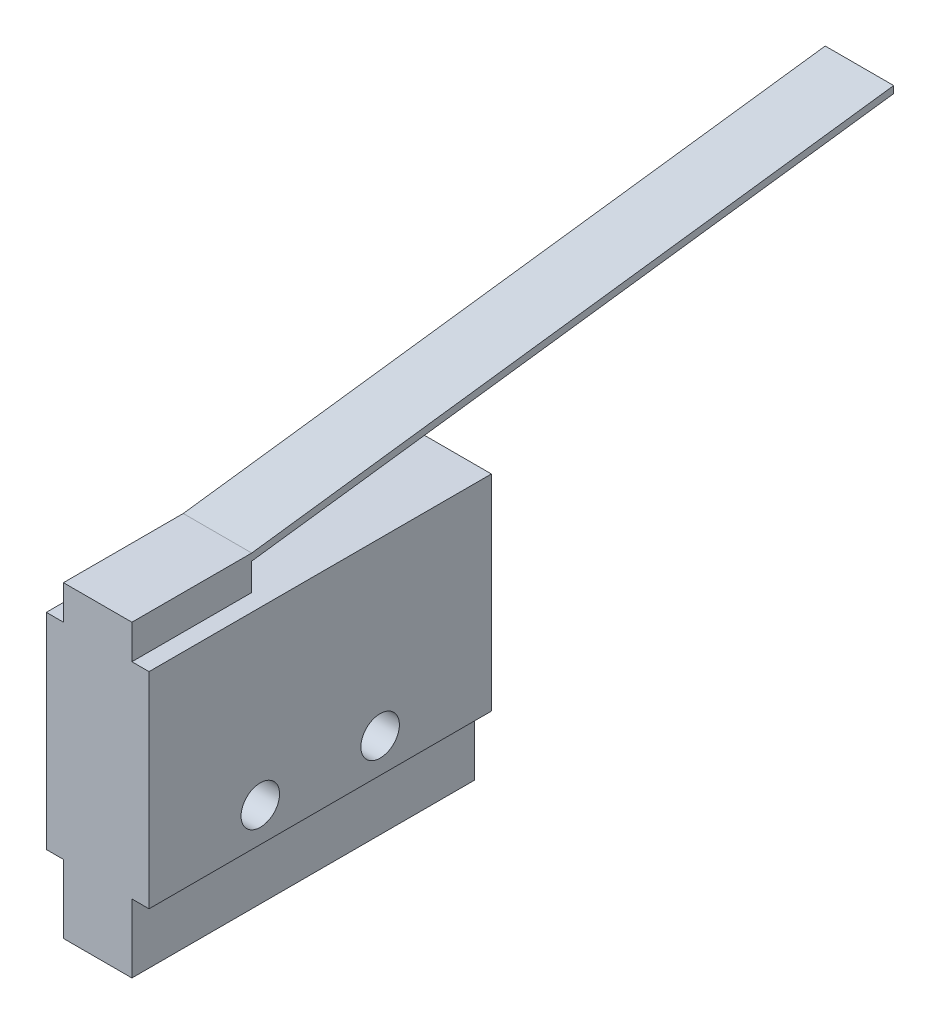
ISO-10303-21;
HEADER;
FILE_DESCRIPTION(('STEP AP214'),'2;1');
FILE_NAME('part.step','',(''),(''),'','','');
FILE_SCHEMA(('AUTOMOTIVE_DESIGN { 1 0 10303 214 1 1 1 1 }'));
ENDSEC;
DATA;
#1=APPLICATION_CONTEXT('core data for automotive mechanical design processes');
#2=APPLICATION_PROTOCOL_DEFINITION('international standard','automotive_design',2000,#1);
#3=PRODUCT_CONTEXT('',#1,'mechanical');
#4=PRODUCT('Part','Part','',(#3));
#5=PRODUCT_RELATED_PRODUCT_CATEGORY('part','',(#4));
#6=PRODUCT_DEFINITION_FORMATION('','',#4);
#7=PRODUCT_DEFINITION_CONTEXT('part definition',#1,'design');
#8=PRODUCT_DEFINITION('design','',#6,#7);
#9=PRODUCT_DEFINITION_SHAPE('','',#8);
#10=(LENGTH_UNIT() NAMED_UNIT(*) SI_UNIT(.MILLI.,.METRE.));
#11=(NAMED_UNIT(*) PLANE_ANGLE_UNIT() SI_UNIT($,.RADIAN.));
#12=(NAMED_UNIT(*) SI_UNIT($,.STERADIAN.) SOLID_ANGLE_UNIT());
#13=UNCERTAINTY_MEASURE_WITH_UNIT(LENGTH_MEASURE(1.E-05),#10,'distance_accuracy_value','');
#14=(GEOMETRIC_REPRESENTATION_CONTEXT(3) GLOBAL_UNCERTAINTY_ASSIGNED_CONTEXT((#13)) GLOBAL_UNIT_ASSIGNED_CONTEXT((#10,
#11,#12)) REPRESENTATION_CONTEXT('',''));
#15=CARTESIAN_POINT('',(0.,0.,0.));
#16=DIRECTION('',(0.,0.,1.));
#17=DIRECTION('',(1.,0.,0.));
#18=AXIS2_PLACEMENT_3D('',#15,#16,#17);
#19=CARTESIAN_POINT('',(0.,10.,0.));
#20=DIRECTION('',(0.,-1.,0.));
#21=DIRECTION('',(0.,0.,-1.));
#22=AXIS2_PLACEMENT_3D('',#19,#20,#21);
#23=PLANE('',#22);
#24=DIRECTION('',(0.,0.,1.));
#25=VECTOR('',#24,1.);
#26=CARTESIAN_POINT('',(1.,10.,0.));
#27=LINE('',#26,#25);
#28=CARTESIAN_POINT('',(1.,10.,-7.));
#29=VERTEX_POINT('',#28);
#30=CARTESIAN_POINT('',(1.,10.,0.));
#31=VERTEX_POINT('',#30);
#32=EDGE_CURVE('E340',#29,#31,#27,.T.);
#33=ORIENTED_EDGE('',*,*,#32,.F.);
#34=DIRECTION('',(-1.,0.,0.));
#35=VECTOR('',#34,1.);
#36=CARTESIAN_POINT('',(1.,10.,-7.));
#37=LINE('',#36,#35);
#38=CARTESIAN_POINT('',(5.,10.,-7.));
#39=VERTEX_POINT('',#38);
#40=EDGE_CURVE('E196',#39,#29,#37,.T.);
#41=ORIENTED_EDGE('',*,*,#40,.F.);
#42=DIRECTION('',(0.,0.,-1.));
#43=VECTOR('',#42,1.);
#44=CARTESIAN_POINT('',(5.,10.,0.));
#45=LINE('',#44,#43);
#46=CARTESIAN_POINT('',(5.,10.,0.));
#47=VERTEX_POINT('',#46);
#48=EDGE_CURVE('E68',#47,#39,#45,.T.);
#49=ORIENTED_EDGE('',*,*,#48,.F.);
#50=DIRECTION('',(1.,0.,0.));
#51=VECTOR('',#50,1.);
#52=CARTESIAN_POINT('',(0.,10.,0.));
#53=LINE('',#52,#51);
#54=CARTESIAN_POINT('',(6.,10.,0.));
#55=VERTEX_POINT('',#54);
#56=EDGE_CURVE('E289',#47,#55,#53,.T.);
#57=ORIENTED_EDGE('',*,*,#56,.T.);
#58=DIRECTION('',(0.,0.,-1.));
#59=VECTOR('',#58,1.);
#60=CARTESIAN_POINT('',(6.,10.,0.));
#61=LINE('',#60,#59);
#62=CARTESIAN_POINT('',(6.,10.,-20.));
#63=VERTEX_POINT('',#62);
#64=EDGE_CURVE('E293',#55,#63,#61,.T.);
#65=ORIENTED_EDGE('',*,*,#64,.T.);
#66=DIRECTION('',(-1.,0.,0.));
#67=VECTOR('',#66,1.);
#68=CARTESIAN_POINT('',(0.,10.,-20.));
#69=LINE('',#68,#67);
#70=CARTESIAN_POINT('',(0.,10.,-20.));
#71=VERTEX_POINT('',#70);
#72=EDGE_CURVE('E296',#63,#71,#69,.T.);
#73=ORIENTED_EDGE('',*,*,#72,.T.);
#74=DIRECTION('',(0.,0.,1.));
#75=VECTOR('',#74,1.);
#76=CARTESIAN_POINT('',(0.,10.,0.));
#77=LINE('',#76,#75);
#78=CARTESIAN_POINT('',(0.,10.,0.));
#79=VERTEX_POINT('',#78);
#80=EDGE_CURVE('E285',#71,#79,#77,.T.);
#81=ORIENTED_EDGE('',*,*,#80,.T.);
#82=EDGE_CURVE('E290',#79,#31,#53,.T.);
#83=ORIENTED_EDGE('',*,*,#82,.T.);
#84=EDGE_LOOP('',(#33,#41,#49,#57,#65,#73,#81,#83));
#85=FACE_BOUND('',#84,.T.);
#86=ADVANCED_FACE('F38',(#85),#23,.F.);
#87=CARTESIAN_POINT('',(0.,-2.,0.));
#88=DIRECTION('',(0.,-1.,0.));
#89=DIRECTION('',(0.,0.,-1.));
#90=AXIS2_PLACEMENT_3D('',#87,#88,#89);
#91=PLANE('',#90);
#92=DIRECTION('',(0.,0.,1.));
#93=VECTOR('',#92,1.);
#94=CARTESIAN_POINT('',(5.,-2.,-20.));
#95=LINE('',#94,#93);
#96=CARTESIAN_POINT('',(5.,-2.,-20.));
#97=VERTEX_POINT('',#96);
#98=CARTESIAN_POINT('',(5.,-2.,0.));
#99=VERTEX_POINT('',#98);
#100=EDGE_CURVE('E219',#97,#99,#95,.T.);
#101=ORIENTED_EDGE('',*,*,#100,.F.);
#102=DIRECTION('',(1.,0.,0.));
#103=VECTOR('',#102,1.);
#104=CARTESIAN_POINT('',(0.,-2.,-20.));
#105=LINE('',#104,#103);
#106=CARTESIAN_POINT('',(6.,-2.,-20.));
#107=VERTEX_POINT('',#106);
#108=EDGE_CURVE('E274',#97,#107,#105,.T.);
#109=ORIENTED_EDGE('',*,*,#108,.T.);
#110=DIRECTION('',(0.,0.,1.));
#111=VECTOR('',#110,1.);
#112=CARTESIAN_POINT('',(6.,-2.,0.));
#113=LINE('',#112,#111);
#114=CARTESIAN_POINT('',(6.,-2.,0.));
#115=VERTEX_POINT('',#114);
#116=EDGE_CURVE('E278',#107,#115,#113,.T.);
#117=ORIENTED_EDGE('',*,*,#116,.T.);
#118=DIRECTION('',(-1.,0.,0.));
#119=VECTOR('',#118,1.);
#120=CARTESIAN_POINT('',(0.,-2.,0.));
#121=LINE('',#120,#119);
#122=EDGE_CURVE('E283',#115,#99,#121,.T.);
#123=ORIENTED_EDGE('',*,*,#122,.T.);
#124=EDGE_LOOP('',(#101,#109,#117,#123));
#125=FACE_BOUND('',#124,.T.);
#126=ADVANCED_FACE('F316',(#125),#91,.T.);
#127=CARTESIAN_POINT('',(0.,10.,0.));
#128=DIRECTION('',(1.,0.,0.));
#129=DIRECTION('',(0.,0.,-1.));
#130=AXIS2_PLACEMENT_3D('',#127,#128,#129);
#131=PLANE('',#130);
#132=CARTESIAN_POINT('',(0.,0.,-6.5));
#133=DIRECTION('',(1.,0.,0.));
#134=DIRECTION('',(0.,0.,-1.));
#135=AXIS2_PLACEMENT_3D('',#132,#133,#134);
#136=CIRCLE('',#135,1.125);
#137=CARTESIAN_POINT('',(0.,0.,-7.625));
#138=VERTEX_POINT('',#137);
#139=EDGE_CURVE('E266',#138,#138,#136,.T.);
#140=ORIENTED_EDGE('',*,*,#139,.T.);
#141=EDGE_LOOP('',(#140));
#142=FACE_BOUND('',#141,.T.);
#143=CARTESIAN_POINT('',(0.,0.,-13.5));
#144=DIRECTION('',(1.,0.,0.));
#145=DIRECTION('',(0.,0.,-1.));
#146=AXIS2_PLACEMENT_3D('',#143,#144,#145);
#147=CIRCLE('',#146,1.125);
#148=CARTESIAN_POINT('',(0.,0.,-14.625));
#149=VERTEX_POINT('',#148);
#150=EDGE_CURVE('E259',#149,#149,#147,.T.);
#151=ORIENTED_EDGE('',*,*,#150,.T.);
#152=EDGE_LOOP('',(#151));
#153=FACE_BOUND('',#152,.T.);
#154=DIRECTION('',(0.,-1.,0.));
#155=VECTOR('',#154,1.);
#156=CARTESIAN_POINT('',(0.,10.,-20.));
#157=LINE('',#156,#155);
#158=CARTESIAN_POINT('',(0.,-2.,-20.));
#159=VERTEX_POINT('',#158);
#160=EDGE_CURVE('E299',#71,#159,#157,.T.);
#161=ORIENTED_EDGE('',*,*,#160,.T.);
#162=DIRECTION('',(0.,0.,-1.));
#163=VECTOR('',#162,1.);
#164=CARTESIAN_POINT('',(0.,-2.,0.));
#165=LINE('',#164,#163);
#166=CARTESIAN_POINT('',(0.,-2.,0.));
#167=VERTEX_POINT('',#166);
#168=EDGE_CURVE('E270',#167,#159,#165,.T.);
#169=ORIENTED_EDGE('',*,*,#168,.F.);
#170=DIRECTION('',(0.,-1.,0.));
#171=VECTOR('',#170,1.);
#172=CARTESIAN_POINT('',(0.,10.,0.));
#173=LINE('',#172,#171);
#174=EDGE_CURVE('E11',#79,#167,#173,.T.);
#175=ORIENTED_EDGE('',*,*,#174,.F.);
#176=ORIENTED_EDGE('',*,*,#80,.F.);
#177=EDGE_LOOP('',(#161,#169,#175,#176));
#178=FACE_BOUND('',#177,.T.);
#179=ADVANCED_FACE('F40',(#142,#153,#178),#131,.F.);
#180=CARTESIAN_POINT('',(0.,10.,0.));
#181=DIRECTION('',(0.,0.,-1.));
#182=DIRECTION('',(-1.,0.,0.));
#183=AXIS2_PLACEMENT_3D('',#180,#181,#182);
#184=PLANE('',#183);
#185=ORIENTED_EDGE('',*,*,#56,.F.);
#186=DIRECTION('',(0.,-1.,0.));
#187=VECTOR('',#186,1.);
#188=CARTESIAN_POINT('',(5.,12.,0.));
#189=LINE('',#188,#187);
#190=CARTESIAN_POINT('',(5.,12.,0.));
#191=VERTEX_POINT('',#190);
#192=EDGE_CURVE('E203',#191,#47,#189,.T.);
#193=ORIENTED_EDGE('',*,*,#192,.F.);
#194=DIRECTION('',(1.,0.,0.));
#195=VECTOR('',#194,1.);
#196=CARTESIAN_POINT('',(1.,12.,0.));
#197=LINE('',#196,#195);
#198=CARTESIAN_POINT('',(1.,12.,0.));
#199=VERTEX_POINT('',#198);
#200=EDGE_CURVE('E344',#199,#191,#197,.T.);
#201=ORIENTED_EDGE('',*,*,#200,.F.);
#202=DIRECTION('',(0.,-1.,0.));
#203=VECTOR('',#202,1.);
#204=CARTESIAN_POINT('',(1.,12.,0.));
#205=LINE('',#204,#203);
#206=EDGE_CURVE('E215',#199,#31,#205,.T.);
#207=ORIENTED_EDGE('',*,*,#206,.T.);
#208=ORIENTED_EDGE('',*,*,#82,.F.);
#209=ORIENTED_EDGE('',*,*,#174,.T.);
#210=CARTESIAN_POINT('',(0.999999999999999,-2.,0.));
#211=VERTEX_POINT('',#210);
#212=EDGE_CURVE('E282',#211,#167,#121,.T.);
#213=ORIENTED_EDGE('',*,*,#212,.F.);
#214=DIRECTION('',(0.,1.,0.));
#215=VECTOR('',#214,1.);
#216=CARTESIAN_POINT('',(0.999999999999997,-6.,0.));
#217=LINE('',#216,#215);
#218=CARTESIAN_POINT('',(0.999999999999997,-6.,0.));
#219=VERTEX_POINT('',#218);
#220=EDGE_CURVE('E247',#219,#211,#217,.T.);
#221=ORIENTED_EDGE('',*,*,#220,.F.);
#222=DIRECTION('',(-1.,0.,0.));
#223=VECTOR('',#222,1.);
#224=CARTESIAN_POINT('',(5.,-6.,0.));
#225=LINE('',#224,#223);
#226=CARTESIAN_POINT('',(5.,-6.,0.));
#227=VERTEX_POINT('',#226);
#228=EDGE_CURVE('E224',#227,#219,#225,.T.);
#229=ORIENTED_EDGE('',*,*,#228,.F.);
#230=DIRECTION('',(0.,1.,0.));
#231=VECTOR('',#230,1.);
#232=CARTESIAN_POINT('',(5.,-6.,0.));
#233=LINE('',#232,#231);
#234=EDGE_CURVE('E251',#227,#99,#233,.T.);
#235=ORIENTED_EDGE('',*,*,#234,.T.);
#236=ORIENTED_EDGE('',*,*,#122,.F.);
#237=DIRECTION('',(0.,-1.,0.));
#238=VECTOR('',#237,1.);
#239=CARTESIAN_POINT('',(6.,10.,0.));
#240=LINE('',#239,#238);
#241=EDGE_CURVE('E47',#55,#115,#240,.T.);
#242=ORIENTED_EDGE('',*,*,#241,.F.);
#243=EDGE_LOOP('',(#185,#193,#201,#207,#208,#209,#213,#221,#229,#235,#236,#242));
#244=FACE_BOUND('',#243,.T.);
#245=ADVANCED_FACE('F318',(#244),#184,.F.);
#246=CARTESIAN_POINT('',(6.,10.,0.));
#247=DIRECTION('',(-1.,0.,0.));
#248=DIRECTION('',(0.,0.,1.));
#249=AXIS2_PLACEMENT_3D('',#246,#247,#248);
#250=PLANE('',#249);
#251=CARTESIAN_POINT('',(6.,0.,-6.5));
#252=DIRECTION('',(1.,0.,0.));
#253=DIRECTION('',(0.,0.,-1.));
#254=AXIS2_PLACEMENT_3D('',#251,#252,#253);
#255=CIRCLE('',#254,1.125);
#256=CARTESIAN_POINT('',(6.,0.,-7.625));
#257=VERTEX_POINT('',#256);
#258=EDGE_CURVE('E255',#257,#257,#255,.T.);
#259=ORIENTED_EDGE('',*,*,#258,.F.);
#260=EDGE_LOOP('',(#259));
#261=FACE_BOUND('',#260,.T.);
#262=CARTESIAN_POINT('',(6.,0.,-13.5));
#263=DIRECTION('',(1.,0.,0.));
#264=DIRECTION('',(0.,0.,-1.));
#265=AXIS2_PLACEMENT_3D('',#262,#263,#264);
#266=CIRCLE('',#265,1.125);
#267=CARTESIAN_POINT('',(6.,0.,-14.625));
#268=VERTEX_POINT('',#267);
#269=EDGE_CURVE('E254',#268,#268,#266,.T.);
#270=ORIENTED_EDGE('',*,*,#269,.F.);
#271=EDGE_LOOP('',(#270));
#272=FACE_BOUND('',#271,.T.);
#273=ORIENTED_EDGE('',*,*,#241,.T.);
#274=ORIENTED_EDGE('',*,*,#116,.F.);
#275=DIRECTION('',(0.,-1.,0.));
#276=VECTOR('',#275,1.);
#277=CARTESIAN_POINT('',(6.,10.,-20.));
#278=LINE('',#277,#276);
#279=EDGE_CURVE('E302',#63,#107,#278,.T.);
#280=ORIENTED_EDGE('',*,*,#279,.F.);
#281=ORIENTED_EDGE('',*,*,#64,.F.);
#282=EDGE_LOOP('',(#273,#274,#280,#281));
#283=FACE_BOUND('',#282,.T.);
#284=ADVANCED_FACE('F311',(#261,#272,#283),#250,.F.);
#285=CARTESIAN_POINT('',(0.,10.,-20.));
#286=DIRECTION('',(0.,0.,1.));
#287=DIRECTION('',(1.,0.,0.));
#288=AXIS2_PLACEMENT_3D('',#285,#286,#287);
#289=PLANE('',#288);
#290=ORIENTED_EDGE('',*,*,#279,.T.);
#291=ORIENTED_EDGE('',*,*,#108,.F.);
#292=DIRECTION('',(0.,1.,0.));
#293=VECTOR('',#292,1.);
#294=CARTESIAN_POINT('',(5.,-6.,-20.));
#295=LINE('',#294,#293);
#296=CARTESIAN_POINT('',(5.,-6.,-20.));
#297=VERTEX_POINT('',#296);
#298=EDGE_CURVE('E233',#297,#97,#295,.T.);
#299=ORIENTED_EDGE('',*,*,#298,.F.);
#300=DIRECTION('',(1.,0.,0.));
#301=VECTOR('',#300,1.);
#302=CARTESIAN_POINT('',(5.,-6.,-20.));
#303=LINE('',#302,#301);
#304=CARTESIAN_POINT('',(1.,-6.,-20.));
#305=VERTEX_POINT('',#304);
#306=EDGE_CURVE('E230',#305,#297,#303,.T.);
#307=ORIENTED_EDGE('',*,*,#306,.F.);
#308=DIRECTION('',(0.,1.,0.));
#309=VECTOR('',#308,1.);
#310=CARTESIAN_POINT('',(1.,-6.,-20.));
#311=LINE('',#310,#309);
#312=CARTESIAN_POINT('',(1.,-2.,-20.));
#313=VERTEX_POINT('',#312);
#314=EDGE_CURVE('E243',#305,#313,#311,.T.);
#315=ORIENTED_EDGE('',*,*,#314,.T.);
#316=EDGE_CURVE('E275',#159,#313,#105,.T.);
#317=ORIENTED_EDGE('',*,*,#316,.F.);
#318=ORIENTED_EDGE('',*,*,#160,.F.);
#319=ORIENTED_EDGE('',*,*,#72,.F.);
#320=EDGE_LOOP('',(#290,#291,#299,#307,#315,#317,#318,#319));
#321=FACE_BOUND('',#320,.T.);
#322=ADVANCED_FACE('F326',(#321),#289,.F.);
#323=DIRECTION('',(0.,0.,-1.));
#324=VECTOR('',#323,1.);
#325=CARTESIAN_POINT('',(1.,-2.,-20.));
#326=LINE('',#325,#324);
#327=EDGE_CURVE('E225',#211,#313,#326,.T.);
#328=ORIENTED_EDGE('',*,*,#327,.F.);
#329=ORIENTED_EDGE('',*,*,#212,.T.);
#330=ORIENTED_EDGE('',*,*,#168,.T.);
#331=ORIENTED_EDGE('',*,*,#316,.T.);
#332=EDGE_LOOP('',(#328,#329,#330,#331));
#333=FACE_BOUND('',#332,.T.);
#334=ADVANCED_FACE('F382',(#333),#91,.T.);
#335=CARTESIAN_POINT('',(-1.,0.,-13.5));
#336=DIRECTION('',(1.,0.,0.));
#337=DIRECTION('',(0.,0.,-1.));
#338=AXIS2_PLACEMENT_3D('',#335,#336,#337);
#339=CYLINDRICAL_SURFACE('',#338,1.125);
#340=ORIENTED_EDGE('',*,*,#269,.T.);
#341=EDGE_LOOP('',(#340));
#342=FACE_BOUND('',#341,.T.);
#343=ORIENTED_EDGE('',*,*,#150,.F.);
#344=EDGE_LOOP('',(#343));
#345=FACE_BOUND('',#344,.T.);
#346=ADVANCED_FACE('F420',(#342,#345),#339,.F.);
#347=CARTESIAN_POINT('',(-1.,0.,-6.5));
#348=DIRECTION('',(1.,0.,0.));
#349=DIRECTION('',(0.,0.,-1.));
#350=AXIS2_PLACEMENT_3D('',#347,#348,#349);
#351=CYLINDRICAL_SURFACE('',#350,1.125);
#352=ORIENTED_EDGE('',*,*,#258,.T.);
#353=EDGE_LOOP('',(#352));
#354=FACE_BOUND('',#353,.T.);
#355=ORIENTED_EDGE('',*,*,#139,.F.);
#356=EDGE_LOOP('',(#355));
#357=FACE_BOUND('',#356,.T.);
#358=ADVANCED_FACE('F422',(#354,#357),#351,.F.);
#359=CARTESIAN_POINT('',(5.,-6.,-20.));
#360=DIRECTION('',(-1.,0.,0.));
#361=DIRECTION('',(0.,0.,1.));
#362=AXIS2_PLACEMENT_3D('',#359,#360,#361);
#363=PLANE('',#362);
#364=ORIENTED_EDGE('',*,*,#100,.T.);
#365=ORIENTED_EDGE('',*,*,#234,.F.);
#366=DIRECTION('',(0.,0.,1.));
#367=VECTOR('',#366,1.);
#368=CARTESIAN_POINT('',(5.,-6.,-20.));
#369=LINE('',#368,#367);
#370=EDGE_CURVE('E220',#297,#227,#369,.T.);
#371=ORIENTED_EDGE('',*,*,#370,.F.);
#372=ORIENTED_EDGE('',*,*,#298,.T.);
#373=EDGE_LOOP('',(#364,#365,#371,#372));
#374=FACE_BOUND('',#373,.T.);
#375=ADVANCED_FACE('F323',(#374),#363,.F.);
#376=CARTESIAN_POINT('',(1.,-6.,-20.));
#377=DIRECTION('',(1.,0.,0.));
#378=DIRECTION('',(0.,0.,-1.));
#379=AXIS2_PLACEMENT_3D('',#376,#377,#378);
#380=PLANE('',#379);
#381=ORIENTED_EDGE('',*,*,#327,.T.);
#382=ORIENTED_EDGE('',*,*,#314,.F.);
#383=DIRECTION('',(0.,0.,-1.));
#384=VECTOR('',#383,1.);
#385=CARTESIAN_POINT('',(1.,-6.,-20.));
#386=LINE('',#385,#384);
#387=EDGE_CURVE('E227',#219,#305,#386,.T.);
#388=ORIENTED_EDGE('',*,*,#387,.F.);
#389=ORIENTED_EDGE('',*,*,#220,.T.);
#390=EDGE_LOOP('',(#381,#382,#388,#389));
#391=FACE_BOUND('',#390,.T.);
#392=ADVANCED_FACE('F385',(#391),#380,.F.);
#393=CARTESIAN_POINT('',(0.,-6.,0.));
#394=DIRECTION('',(0.,-1.,0.));
#395=DIRECTION('',(0.,0.,-1.));
#396=AXIS2_PLACEMENT_3D('',#393,#394,#395);
#397=PLANE('',#396);
#398=ORIENTED_EDGE('',*,*,#370,.T.);
#399=ORIENTED_EDGE('',*,*,#228,.T.);
#400=ORIENTED_EDGE('',*,*,#387,.T.);
#401=ORIENTED_EDGE('',*,*,#306,.T.);
#402=EDGE_LOOP('',(#398,#399,#400,#401));
#403=FACE_BOUND('',#402,.T.);
#404=ADVANCED_FACE('F388',(#403),#397,.T.);
#405=CARTESIAN_POINT('',(1.,12.,0.));
#406=DIRECTION('',(1.,0.,0.));
#407=DIRECTION('',(0.,0.,-1.));
#408=AXIS2_PLACEMENT_3D('',#405,#406,#407);
#409=PLANE('',#408);
#410=ORIENTED_EDGE('',*,*,#32,.T.);
#411=ORIENTED_EDGE('',*,*,#206,.F.);
#412=DIRECTION('',(0.,0.,1.));
#413=VECTOR('',#412,1.);
#414=CARTESIAN_POINT('',(1.,12.,0.));
#415=LINE('',#414,#413);
#416=CARTESIAN_POINT('',(1.,12.,-7.));
#417=VERTEX_POINT('',#416);
#418=EDGE_CURVE('E345',#417,#199,#415,.T.);
#419=ORIENTED_EDGE('',*,*,#418,.F.);
#420=DIRECTION('',(0.,-0.129565263785247,0.991570896315669));
#421=VECTOR('',#420,1.);
#422=CARTESIAN_POINT('',(1.,12.,-7.));
#423=LINE('',#422,#421);
#424=CARTESIAN_POINT('',(1.,16.9,-44.5));
#425=VERTEX_POINT('',#424);
#426=EDGE_CURVE('E184',#425,#417,#423,.T.);
#427=ORIENTED_EDGE('',*,*,#426,.F.);
#428=DIRECTION('',(0.,1.,0.));
#429=VECTOR('',#428,1.);
#430=CARTESIAN_POINT('',(1.,16.9,-44.5));
#431=LINE('',#430,#429);
#432=CARTESIAN_POINT('',(1.,16.4911607329312,-44.5));
#433=VERTEX_POINT('',#432);
#434=EDGE_CURVE('E190',#433,#425,#431,.T.);
#435=ORIENTED_EDGE('',*,*,#434,.F.);
#436=DIRECTION('',(0.,0.129565263785248,-0.991570896315669));
#437=VECTOR('',#436,1.);
#438=CARTESIAN_POINT('',(1.,16.4911607329312,-44.5));
#439=LINE('',#438,#437);
#440=CARTESIAN_POINT('',(1.,11.5911607329312,-7.));
#441=VERTEX_POINT('',#440);
#442=EDGE_CURVE('E177',#441,#433,#439,.T.);
#443=ORIENTED_EDGE('',*,*,#442,.F.);
#444=DIRECTION('',(0.,-1.,0.));
#445=VECTOR('',#444,1.);
#446=CARTESIAN_POINT('',(1.,12.,-7.));
#447=LINE('',#446,#445);
#448=EDGE_CURVE('E57',#441,#29,#447,.T.);
#449=ORIENTED_EDGE('',*,*,#448,.T.);
#450=EDGE_LOOP('',(#410,#411,#419,#427,#435,#443,#449));
#451=FACE_BOUND('',#450,.T.);
#452=ADVANCED_FACE('F187',(#451),#409,.F.);
#453=CARTESIAN_POINT('',(5.,12.,0.));
#454=DIRECTION('',(-1.,0.,0.));
#455=DIRECTION('',(0.,0.,1.));
#456=AXIS2_PLACEMENT_3D('',#453,#454,#455);
#457=PLANE('',#456);
#458=ORIENTED_EDGE('',*,*,#48,.T.);
#459=DIRECTION('',(0.,-1.,0.));
#460=VECTOR('',#459,1.);
#461=CARTESIAN_POINT('',(5.,12.,-7.));
#462=LINE('',#461,#460);
#463=CARTESIAN_POINT('',(5.,11.5911607329312,-7.));
#464=VERTEX_POINT('',#463);
#465=EDGE_CURVE('E198',#464,#39,#462,.T.);
#466=ORIENTED_EDGE('',*,*,#465,.F.);
#467=DIRECTION('',(0.,0.129565263785248,-0.991570896315669));
#468=VECTOR('',#467,1.);
#469=CARTESIAN_POINT('',(5.,16.4911607329312,-44.5));
#470=LINE('',#469,#468);
#471=CARTESIAN_POINT('',(5.,16.4911607329312,-44.5));
#472=VERTEX_POINT('',#471);
#473=EDGE_CURVE('E179',#464,#472,#470,.T.);
#474=ORIENTED_EDGE('',*,*,#473,.T.);
#475=DIRECTION('',(0.,1.,0.));
#476=VECTOR('',#475,1.);
#477=CARTESIAN_POINT('',(5.,16.9,-44.5));
#478=LINE('',#477,#476);
#479=CARTESIAN_POINT('',(5.,16.9,-44.5));
#480=VERTEX_POINT('',#479);
#481=EDGE_CURVE('E331',#472,#480,#478,.T.);
#482=ORIENTED_EDGE('',*,*,#481,.T.);
#483=DIRECTION('',(0.,-0.129565263785247,0.991570896315669));
#484=VECTOR('',#483,1.);
#485=CARTESIAN_POINT('',(5.,12.,-7.));
#486=LINE('',#485,#484);
#487=CARTESIAN_POINT('',(5.,12.,-7.));
#488=VERTEX_POINT('',#487);
#489=EDGE_CURVE('E192',#480,#488,#486,.T.);
#490=ORIENTED_EDGE('',*,*,#489,.T.);
#491=DIRECTION('',(0.,0.,-1.));
#492=VECTOR('',#491,1.);
#493=CARTESIAN_POINT('',(5.,12.,0.));
#494=LINE('',#493,#492);
#495=EDGE_CURVE('E207',#191,#488,#494,.T.);
#496=ORIENTED_EDGE('',*,*,#495,.F.);
#497=ORIENTED_EDGE('',*,*,#192,.T.);
#498=EDGE_LOOP('',(#458,#466,#474,#482,#490,#496,#497));
#499=FACE_BOUND('',#498,.T.);
#500=ADVANCED_FACE('F350',(#499),#457,.F.);
#501=CARTESIAN_POINT('',(1.,12.,-7.));
#502=DIRECTION('',(0.,0.,1.));
#503=DIRECTION('',(1.,0.,0.));
#504=AXIS2_PLACEMENT_3D('',#501,#502,#503);
#505=PLANE('',#504);
#506=ORIENTED_EDGE('',*,*,#448,.F.);
#507=DIRECTION('',(1.,0.,0.));
#508=VECTOR('',#507,1.);
#509=CARTESIAN_POINT('',(1.,11.5911607329312,-7.));
#510=LINE('',#509,#508);
#511=EDGE_CURVE('E175',#441,#464,#510,.T.);
#512=ORIENTED_EDGE('',*,*,#511,.T.);
#513=ORIENTED_EDGE('',*,*,#465,.T.);
#514=ORIENTED_EDGE('',*,*,#40,.T.);
#515=EDGE_LOOP('',(#506,#512,#513,#514));
#516=FACE_BOUND('',#515,.T.);
#517=ADVANCED_FACE('F195',(#516),#505,.F.);
#518=CARTESIAN_POINT('',(0.,12.,0.));
#519=DIRECTION('',(0.,-1.,0.));
#520=DIRECTION('',(0.,0.,-1.));
#521=AXIS2_PLACEMENT_3D('',#518,#519,#520);
#522=PLANE('',#521);
#523=ORIENTED_EDGE('',*,*,#418,.T.);
#524=ORIENTED_EDGE('',*,*,#200,.T.);
#525=ORIENTED_EDGE('',*,*,#495,.T.);
#526=DIRECTION('',(-1.,0.,0.));
#527=VECTOR('',#526,1.);
#528=CARTESIAN_POINT('',(1.,12.,-7.));
#529=LINE('',#528,#527);
#530=EDGE_CURVE('E199',#488,#417,#529,.T.);
#531=ORIENTED_EDGE('',*,*,#530,.T.);
#532=EDGE_LOOP('',(#523,#524,#525,#531));
#533=FACE_BOUND('',#532,.T.);
#534=ADVANCED_FACE('F373',(#533),#522,.F.);
#535=CARTESIAN_POINT('',(1.,12.,-7.));
#536=DIRECTION('',(0.,0.991570896315669,0.129565263785247));
#537=DIRECTION('',(0.,-0.129565263785247,0.991570896315669));
#538=AXIS2_PLACEMENT_3D('',#535,#536,#537);
#539=PLANE('',#538);
#540=ORIENTED_EDGE('',*,*,#489,.F.);
#541=DIRECTION('',(1.,0.,0.));
#542=VECTOR('',#541,1.);
#543=CARTESIAN_POINT('',(1.,16.9,-44.5));
#544=LINE('',#543,#542);
#545=EDGE_CURVE('E336',#425,#480,#544,.T.);
#546=ORIENTED_EDGE('',*,*,#545,.F.);
#547=ORIENTED_EDGE('',*,*,#426,.T.);
#548=ORIENTED_EDGE('',*,*,#530,.F.);
#549=EDGE_LOOP('',(#540,#546,#547,#548));
#550=FACE_BOUND('',#549,.T.);
#551=ADVANCED_FACE('F372',(#550),#539,.T.);
#552=CARTESIAN_POINT('',(1.,16.9,-44.5));
#553=DIRECTION('',(0.,0.,-1.));
#554=DIRECTION('',(-1.,0.,0.));
#555=AXIS2_PLACEMENT_3D('',#552,#553,#554);
#556=PLANE('',#555);
#557=ORIENTED_EDGE('',*,*,#481,.F.);
#558=DIRECTION('',(1.,0.,0.));
#559=VECTOR('',#558,1.);
#560=CARTESIAN_POINT('',(1.,16.4911607329312,-44.5));
#561=LINE('',#560,#559);
#562=EDGE_CURVE('E183',#433,#472,#561,.T.);
#563=ORIENTED_EDGE('',*,*,#562,.F.);
#564=ORIENTED_EDGE('',*,*,#434,.T.);
#565=ORIENTED_EDGE('',*,*,#545,.T.);
#566=EDGE_LOOP('',(#557,#563,#564,#565));
#567=FACE_BOUND('',#566,.T.);
#568=ADVANCED_FACE('F494',(#567),#556,.T.);
#569=CARTESIAN_POINT('',(1.,16.4911607329312,-44.5));
#570=DIRECTION('',(0.,-0.991570896315669,-0.129565263785248));
#571=DIRECTION('',(0.,0.129565263785248,-0.991570896315669));
#572=AXIS2_PLACEMENT_3D('',#569,#570,#571);
#573=PLANE('',#572);
#574=ORIENTED_EDGE('',*,*,#473,.F.);
#575=ORIENTED_EDGE('',*,*,#511,.F.);
#576=ORIENTED_EDGE('',*,*,#442,.T.);
#577=ORIENTED_EDGE('',*,*,#562,.T.);
#578=EDGE_LOOP('',(#574,#575,#576,#577));
#579=FACE_BOUND('',#578,.T.);
#580=ADVANCED_FACE('F176',(#579),#573,.T.);
#581=CLOSED_SHELL('',(#86,#126,#179,#245,#284,#322,#334,#346,#358,#375,#392,#404,#452,#500,#517,
#534,#551,#568,#580));
#582=MANIFOLD_SOLID_BREP('B2',#581);
#583=ADVANCED_BREP_SHAPE_REPRESENTATION('',(#18,#582),#14);
#584=SHAPE_DEFINITION_REPRESENTATION(#9,#583);
ENDSEC;
END-ISO-10303-21;
